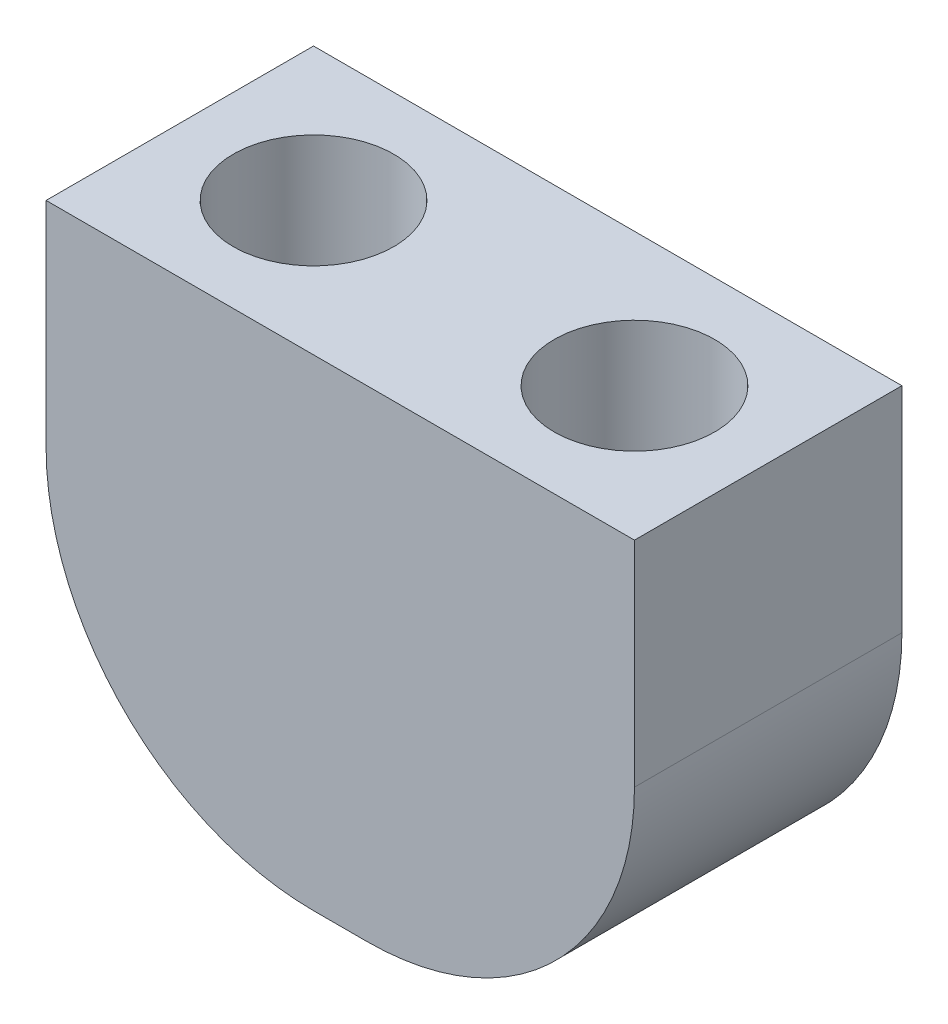
ISO-10303-21;
HEADER;
FILE_DESCRIPTION(('STEP AP214'),'2;1');
FILE_NAME('part.step','',(''),(''),'','','');
FILE_SCHEMA(('AUTOMOTIVE_DESIGN { 1 0 10303 214 1 1 1 1 }'));
ENDSEC;
DATA;
#1=APPLICATION_CONTEXT('core data for automotive mechanical design processes');
#2=APPLICATION_PROTOCOL_DEFINITION('international standard','automotive_design',2000,#1);
#3=PRODUCT_CONTEXT('',#1,'mechanical');
#4=PRODUCT('Part','Part','',(#3));
#5=PRODUCT_RELATED_PRODUCT_CATEGORY('part','',(#4));
#6=PRODUCT_DEFINITION_FORMATION('','',#4);
#7=PRODUCT_DEFINITION_CONTEXT('part definition',#1,'design');
#8=PRODUCT_DEFINITION('design','',#6,#7);
#9=PRODUCT_DEFINITION_SHAPE('','',#8);
#10=(LENGTH_UNIT() NAMED_UNIT(*) SI_UNIT(.MILLI.,.METRE.));
#11=(NAMED_UNIT(*) PLANE_ANGLE_UNIT() SI_UNIT($,.RADIAN.));
#12=(NAMED_UNIT(*) SI_UNIT($,.STERADIAN.) SOLID_ANGLE_UNIT());
#13=UNCERTAINTY_MEASURE_WITH_UNIT(LENGTH_MEASURE(1.E-05),#10,'distance_accuracy_value','');
#14=(GEOMETRIC_REPRESENTATION_CONTEXT(3) GLOBAL_UNCERTAINTY_ASSIGNED_CONTEXT((#13)) GLOBAL_UNIT_ASSIGNED_CONTEXT((#10,
#11,#12)) REPRESENTATION_CONTEXT('',''));
#15=CARTESIAN_POINT('',(0.,0.,0.));
#16=DIRECTION('',(0.,0.,1.));
#17=DIRECTION('',(1.,0.,0.));
#18=AXIS2_PLACEMENT_3D('',#15,#16,#17);
#19=CARTESIAN_POINT('',(11.,28.,-5.));
#20=DIRECTION('',(-1.,0.,0.));
#21=DIRECTION('',(0.,0.,1.));
#22=AXIS2_PLACEMENT_3D('',#19,#20,#21);
#23=PLANE('',#22);
#24=DIRECTION('',(0.,-1.,0.));
#25=VECTOR('',#24,1.);
#26=CARTESIAN_POINT('',(11.,28.,5.));
#27=LINE('',#26,#25);
#28=CARTESIAN_POINT('',(11.,28.,5.));
#29=VERTEX_POINT('',#28);
#30=CARTESIAN_POINT('',(11.,20.,5.));
#31=VERTEX_POINT('',#30);
#32=EDGE_CURVE('E147',#29,#31,#27,.T.);
#33=ORIENTED_EDGE('',*,*,#32,.T.);
#34=DIRECTION('',(0.,0.,-1.));
#35=VECTOR('',#34,1.);
#36=CARTESIAN_POINT('',(11.,20.,-5.));
#37=LINE('',#36,#35);
#38=CARTESIAN_POINT('',(11.,20.,-5.));
#39=VERTEX_POINT('',#38);
#40=EDGE_CURVE('E119',#31,#39,#37,.T.);
#41=ORIENTED_EDGE('',*,*,#40,.T.);
#42=DIRECTION('',(0.,-1.,0.));
#43=VECTOR('',#42,1.);
#44=CARTESIAN_POINT('',(11.,28.,-5.));
#45=LINE('',#44,#43);
#46=CARTESIAN_POINT('',(11.,28.,-5.));
#47=VERTEX_POINT('',#46);
#48=EDGE_CURVE('E99',#47,#39,#45,.T.);
#49=ORIENTED_EDGE('',*,*,#48,.F.);
#50=DIRECTION('',(0.,0.,-1.));
#51=VECTOR('',#50,1.);
#52=CARTESIAN_POINT('',(11.,28.,-5.));
#53=LINE('',#52,#51);
#54=EDGE_CURVE('E105',#29,#47,#53,.T.);
#55=ORIENTED_EDGE('',*,*,#54,.F.);
#56=EDGE_LOOP('',(#33,#41,#49,#55));
#57=FACE_BOUND('',#56,.T.);
#58=ADVANCED_FACE('F39',(#57),#23,.F.);
#59=CARTESIAN_POINT('',(-11.,28.,-5.));
#60=DIRECTION('',(0.,0.,1.));
#61=DIRECTION('',(1.,0.,0.));
#62=AXIS2_PLACEMENT_3D('',#59,#60,#61);
#63=PLANE('',#62);
#64=CARTESIAN_POINT('',(0.,17.,-5.));
#65=DIRECTION('',(0.,0.,-1.));
#66=DIRECTION('',(-1.,0.,0.));
#67=AXIS2_PLACEMENT_3D('',#64,#65,#66);
#68=CIRCLE('',#67,5.);
#69=CARTESIAN_POINT('',(-5.,17.,-5.));
#70=VERTEX_POINT('',#69);
#71=EDGE_CURVE('E165',#70,#70,#68,.T.);
#72=ORIENTED_EDGE('',*,*,#71,.F.);
#73=EDGE_LOOP('',(#72));
#74=FACE_BOUND('',#73,.T.);
#75=ORIENTED_EDGE('',*,*,#48,.T.);
#76=CARTESIAN_POINT('',(0.999999999999999,20.,-5.));
#77=DIRECTION('',(0.,0.,1.));
#78=DIRECTION('',(1.,0.,0.));
#79=AXIS2_PLACEMENT_3D('',#76,#77,#78);
#80=CIRCLE('',#79,10.);
#81=CARTESIAN_POINT('',(0.999999999999997,10.,-5.));
#82=VERTEX_POINT('',#81);
#83=EDGE_CURVE('E132',#39,#82,#80,.F.);
#84=ORIENTED_EDGE('',*,*,#83,.T.);
#85=DIRECTION('',(1.,0.,0.));
#86=VECTOR('',#85,1.);
#87=CARTESIAN_POINT('',(-11.,10.,-5.));
#88=LINE('',#87,#86);
#89=CARTESIAN_POINT('',(-1.,10.,-5.));
#90=VERTEX_POINT('',#89);
#91=EDGE_CURVE('E154',#90,#82,#88,.T.);
#92=ORIENTED_EDGE('',*,*,#91,.F.);
#93=CARTESIAN_POINT('',(-0.999999999999999,20.,-5.));
#94=DIRECTION('',(0.,0.,1.));
#95=DIRECTION('',(1.,0.,0.));
#96=AXIS2_PLACEMENT_3D('',#93,#94,#95);
#97=CIRCLE('',#96,10.);
#98=CARTESIAN_POINT('',(-11.,20.,-5.));
#99=VERTEX_POINT('',#98);
#100=EDGE_CURVE('E124',#90,#99,#97,.F.);
#101=ORIENTED_EDGE('',*,*,#100,.T.);
#102=DIRECTION('',(0.,-1.,0.));
#103=VECTOR('',#102,1.);
#104=CARTESIAN_POINT('',(-11.,28.,-5.));
#105=LINE('',#104,#103);
#106=CARTESIAN_POINT('',(-11.,28.,-5.));
#107=VERTEX_POINT('',#106);
#108=EDGE_CURVE('E100',#107,#99,#105,.T.);
#109=ORIENTED_EDGE('',*,*,#108,.F.);
#110=DIRECTION('',(-1.,0.,0.));
#111=VECTOR('',#110,1.);
#112=CARTESIAN_POINT('',(-11.,28.,-5.));
#113=LINE('',#112,#111);
#114=EDGE_CURVE('E95',#47,#107,#113,.T.);
#115=ORIENTED_EDGE('',*,*,#114,.F.);
#116=EDGE_LOOP('',(#75,#84,#92,#101,#109,#115));
#117=FACE_BOUND('',#116,.T.);
#118=ADVANCED_FACE('F97',(#74,#117),#63,.F.);
#119=CARTESIAN_POINT('',(-11.,28.,-5.));
#120=DIRECTION('',(1.,0.,0.));
#121=DIRECTION('',(0.,0.,-1.));
#122=AXIS2_PLACEMENT_3D('',#119,#120,#121);
#123=PLANE('',#122);
#124=ORIENTED_EDGE('',*,*,#108,.T.);
#125=DIRECTION('',(0.,0.,-1.));
#126=VECTOR('',#125,1.);
#127=CARTESIAN_POINT('',(-11.,20.,-5.));
#128=LINE('',#127,#126);
#129=CARTESIAN_POINT('',(-11.,20.,5.));
#130=VERTEX_POINT('',#129);
#131=EDGE_CURVE('E11',#99,#130,#128,.F.);
#132=ORIENTED_EDGE('',*,*,#131,.T.);
#133=DIRECTION('',(0.,-1.,0.));
#134=VECTOR('',#133,1.);
#135=CARTESIAN_POINT('',(-11.,28.,5.));
#136=LINE('',#135,#134);
#137=CARTESIAN_POINT('',(-11.,28.,5.));
#138=VERTEX_POINT('',#137);
#139=EDGE_CURVE('E126',#138,#130,#136,.T.);
#140=ORIENTED_EDGE('',*,*,#139,.F.);
#141=DIRECTION('',(0.,0.,1.));
#142=VECTOR('',#141,1.);
#143=CARTESIAN_POINT('',(-11.,28.,-5.));
#144=LINE('',#143,#142);
#145=EDGE_CURVE('E104',#107,#138,#144,.T.);
#146=ORIENTED_EDGE('',*,*,#145,.F.);
#147=EDGE_LOOP('',(#124,#132,#140,#146));
#148=FACE_BOUND('',#147,.T.);
#149=ADVANCED_FACE('F189',(#148),#123,.F.);
#150=CARTESIAN_POINT('',(-11.,28.,5.));
#151=DIRECTION('',(0.,0.,-1.));
#152=DIRECTION('',(-1.,0.,0.));
#153=AXIS2_PLACEMENT_3D('',#150,#151,#152);
#154=PLANE('',#153);
#155=DIRECTION('',(1.,0.,0.));
#156=VECTOR('',#155,1.);
#157=CARTESIAN_POINT('',(-11.,10.,5.));
#158=LINE('',#157,#156);
#159=CARTESIAN_POINT('',(-1.,10.,5.));
#160=VERTEX_POINT('',#159);
#161=CARTESIAN_POINT('',(0.999999999999997,10.,5.));
#162=VERTEX_POINT('',#161);
#163=EDGE_CURVE('E148',#160,#162,#158,.T.);
#164=ORIENTED_EDGE('',*,*,#163,.T.);
#165=CARTESIAN_POINT('',(0.999999999999999,20.,5.));
#166=DIRECTION('',(0.,0.,-1.));
#167=DIRECTION('',(-1.,0.,0.));
#168=AXIS2_PLACEMENT_3D('',#165,#166,#167);
#169=CIRCLE('',#168,10.);
#170=EDGE_CURVE('E48',#162,#31,#169,.F.);
#171=ORIENTED_EDGE('',*,*,#170,.T.);
#172=ORIENTED_EDGE('',*,*,#32,.F.);
#173=DIRECTION('',(1.,0.,0.));
#174=VECTOR('',#173,1.);
#175=CARTESIAN_POINT('',(-11.,28.,5.));
#176=LINE('',#175,#174);
#177=EDGE_CURVE('E110',#138,#29,#176,.T.);
#178=ORIENTED_EDGE('',*,*,#177,.F.);
#179=ORIENTED_EDGE('',*,*,#139,.T.);
#180=CARTESIAN_POINT('',(-0.999999999999999,20.,5.));
#181=DIRECTION('',(0.,0.,-1.));
#182=DIRECTION('',(-1.,0.,0.));
#183=AXIS2_PLACEMENT_3D('',#180,#181,#182);
#184=CIRCLE('',#183,10.);
#185=EDGE_CURVE('E141',#130,#160,#184,.F.);
#186=ORIENTED_EDGE('',*,*,#185,.T.);
#187=EDGE_LOOP('',(#164,#171,#172,#178,#179,#186));
#188=FACE_BOUND('',#187,.T.);
#189=ADVANCED_FACE('F146',(#188),#154,.F.);
#190=CARTESIAN_POINT('',(0.,28.,0.));
#191=DIRECTION('',(0.,1.,0.));
#192=DIRECTION('',(0.,0.,1.));
#193=AXIS2_PLACEMENT_3D('',#190,#191,#192);
#194=PLANE('',#193);
#195=CARTESIAN_POINT('',(-6.,28.,0.));
#196=DIRECTION('',(0.,1.,0.));
#197=DIRECTION('',(0.,0.,1.));
#198=AXIS2_PLACEMENT_3D('',#195,#196,#197);
#199=CIRCLE('',#198,3.);
#200=CARTESIAN_POINT('',(-6.,28.,3.));
#201=VERTEX_POINT('',#200);
#202=EDGE_CURVE('E172',#201,#201,#199,.T.);
#203=ORIENTED_EDGE('',*,*,#202,.F.);
#204=EDGE_LOOP('',(#203));
#205=FACE_BOUND('',#204,.T.);
#206=CARTESIAN_POINT('',(6.,28.,0.));
#207=DIRECTION('',(0.,1.,0.));
#208=DIRECTION('',(0.,0.,1.));
#209=AXIS2_PLACEMENT_3D('',#206,#207,#208);
#210=CIRCLE('',#209,3.);
#211=CARTESIAN_POINT('',(6.,28.,3.));
#212=VERTEX_POINT('',#211);
#213=EDGE_CURVE('E162',#212,#212,#210,.T.);
#214=ORIENTED_EDGE('',*,*,#213,.F.);
#215=EDGE_LOOP('',(#214));
#216=FACE_BOUND('',#215,.T.);
#217=ORIENTED_EDGE('',*,*,#54,.T.);
#218=ORIENTED_EDGE('',*,*,#114,.T.);
#219=ORIENTED_EDGE('',*,*,#145,.T.);
#220=ORIENTED_EDGE('',*,*,#177,.T.);
#221=EDGE_LOOP('',(#217,#218,#219,#220));
#222=FACE_BOUND('',#221,.T.);
#223=ADVANCED_FACE('F108',(#205,#216,#222),#194,.T.);
#224=CARTESIAN_POINT('',(6.,23.,0.));
#225=DIRECTION('',(0.,1.,0.));
#226=DIRECTION('',(0.,0.,1.));
#227=AXIS2_PLACEMENT_3D('',#224,#225,#226);
#228=CYLINDRICAL_SURFACE('',#227,3.);
#229=CARTESIAN_POINT('',(6.,23.,0.));
#230=DIRECTION('',(0.,1.,0.));
#231=DIRECTION('',(0.,0.,1.));
#232=AXIS2_PLACEMENT_3D('',#229,#230,#231);
#233=CIRCLE('',#232,3.);
#234=CARTESIAN_POINT('',(6.,23.,3.));
#235=VERTEX_POINT('',#234);
#236=EDGE_CURVE('E176',#235,#235,#233,.T.);
#237=ORIENTED_EDGE('',*,*,#236,.F.);
#238=EDGE_LOOP('',(#237));
#239=FACE_BOUND('',#238,.T.);
#240=ORIENTED_EDGE('',*,*,#213,.T.);
#241=EDGE_LOOP('',(#240));
#242=FACE_BOUND('',#241,.T.);
#243=ADVANCED_FACE('F231',(#239,#242),#228,.F.);
#244=CARTESIAN_POINT('',(6.,23.,0.));
#245=DIRECTION('',(0.,1.,0.));
#246=DIRECTION('',(0.,0.,1.));
#247=AXIS2_PLACEMENT_3D('',#244,#245,#246);
#248=PLANE('',#247);
#249=ORIENTED_EDGE('',*,*,#236,.T.);
#250=EDGE_LOOP('',(#249));
#251=FACE_BOUND('',#250,.T.);
#252=ADVANCED_FACE('F227',(#251),#248,.T.);
#253=CARTESIAN_POINT('',(-6.,23.,0.));
#254=DIRECTION('',(0.,1.,0.));
#255=DIRECTION('',(0.,0.,1.));
#256=AXIS2_PLACEMENT_3D('',#253,#254,#255);
#257=CYLINDRICAL_SURFACE('',#256,3.);
#258=CARTESIAN_POINT('',(-6.,23.,0.));
#259=DIRECTION('',(0.,1.,0.));
#260=DIRECTION('',(0.,0.,1.));
#261=AXIS2_PLACEMENT_3D('',#258,#259,#260);
#262=CIRCLE('',#261,3.);
#263=CARTESIAN_POINT('',(-6.,23.,3.));
#264=VERTEX_POINT('',#263);
#265=EDGE_CURVE('E115',#264,#264,#262,.T.);
#266=ORIENTED_EDGE('',*,*,#265,.F.);
#267=EDGE_LOOP('',(#266));
#268=FACE_BOUND('',#267,.T.);
#269=ORIENTED_EDGE('',*,*,#202,.T.);
#270=EDGE_LOOP('',(#269));
#271=FACE_BOUND('',#270,.T.);
#272=ADVANCED_FACE('F223',(#268,#271),#257,.F.);
#273=CARTESIAN_POINT('',(-6.,23.,0.));
#274=DIRECTION('',(0.,1.,0.));
#275=DIRECTION('',(0.,0.,1.));
#276=AXIS2_PLACEMENT_3D('',#273,#274,#275);
#277=PLANE('',#276);
#278=ORIENTED_EDGE('',*,*,#265,.T.);
#279=EDGE_LOOP('',(#278));
#280=FACE_BOUND('',#279,.T.);
#281=ADVANCED_FACE('F220',(#280),#277,.T.);
#282=CARTESIAN_POINT('',(-11.,10.,5.));
#283=DIRECTION('',(0.,1.,0.));
#284=DIRECTION('',(-1.,0.,0.));
#285=AXIS2_PLACEMENT_3D('',#282,#283,#284);
#286=PLANE('',#285);
#287=ORIENTED_EDGE('',*,*,#91,.T.);
#288=DIRECTION('',(0.,0.,-1.));
#289=VECTOR('',#288,1.);
#290=CARTESIAN_POINT('',(0.999999999999997,10.,5.));
#291=LINE('',#290,#289);
#292=EDGE_CURVE('E61',#82,#162,#291,.F.);
#293=ORIENTED_EDGE('',*,*,#292,.T.);
#294=ORIENTED_EDGE('',*,*,#163,.F.);
#295=DIRECTION('',(0.,0.,-1.));
#296=VECTOR('',#295,1.);
#297=CARTESIAN_POINT('',(-1.,10.,5.));
#298=LINE('',#297,#296);
#299=EDGE_CURVE('E135',#160,#90,#298,.T.);
#300=ORIENTED_EDGE('',*,*,#299,.T.);
#301=EDGE_LOOP('',(#287,#293,#294,#300));
#302=FACE_BOUND('',#301,.T.);
#303=ADVANCED_FACE('F155',(#302),#286,.F.);
#304=CARTESIAN_POINT('',(0.,17.,0.));
#305=DIRECTION('',(0.,0.,-1.));
#306=DIRECTION('',(-1.,0.,0.));
#307=AXIS2_PLACEMENT_3D('',#304,#305,#306);
#308=CYLINDRICAL_SURFACE('',#307,5.);
#309=CARTESIAN_POINT('',(0.,17.,0.));
#310=DIRECTION('',(0.,0.,-1.));
#311=DIRECTION('',(-1.,0.,0.));
#312=AXIS2_PLACEMENT_3D('',#309,#310,#311);
#313=CIRCLE('',#312,5.);
#314=CARTESIAN_POINT('',(-5.,17.,0.));
#315=VERTEX_POINT('',#314);
#316=EDGE_CURVE('E158',#315,#315,#313,.T.);
#317=ORIENTED_EDGE('',*,*,#316,.F.);
#318=EDGE_LOOP('',(#317));
#319=FACE_BOUND('',#318,.T.);
#320=ORIENTED_EDGE('',*,*,#71,.T.);
#321=EDGE_LOOP('',(#320));
#322=FACE_BOUND('',#321,.T.);
#323=ADVANCED_FACE('F209',(#319,#322),#308,.F.);
#324=CARTESIAN_POINT('',(0.,17.,0.));
#325=DIRECTION('',(0.,0.,-1.));
#326=DIRECTION('',(-1.,0.,0.));
#327=AXIS2_PLACEMENT_3D('',#324,#325,#326);
#328=PLANE('',#327);
#329=ORIENTED_EDGE('',*,*,#316,.T.);
#330=EDGE_LOOP('',(#329));
#331=FACE_BOUND('',#330,.T.);
#332=ADVANCED_FACE('F204',(#331),#328,.T.);
#333=CARTESIAN_POINT('',(0.999999999999999,20.,-5.));
#334=DIRECTION('',(0.,0.,-1.));
#335=DIRECTION('',(0.,1.,0.));
#336=AXIS2_PLACEMENT_3D('',#333,#334,#335);
#337=CYLINDRICAL_SURFACE('',#336,10.);
#338=ORIENTED_EDGE('',*,*,#170,.F.);
#339=ORIENTED_EDGE('',*,*,#292,.F.);
#340=ORIENTED_EDGE('',*,*,#83,.F.);
#341=ORIENTED_EDGE('',*,*,#40,.F.);
#342=EDGE_LOOP('',(#338,#339,#340,#341));
#343=FACE_BOUND('',#342,.T.);
#344=ADVANCED_FACE('F152',(#343),#337,.T.);
#345=CARTESIAN_POINT('',(-0.999999999999999,20.,5.));
#346=DIRECTION('',(0.,0.,-1.));
#347=DIRECTION('',(0.,1.,0.));
#348=AXIS2_PLACEMENT_3D('',#345,#346,#347);
#349=CYLINDRICAL_SURFACE('',#348,10.);
#350=ORIENTED_EDGE('',*,*,#185,.F.);
#351=ORIENTED_EDGE('',*,*,#131,.F.);
#352=ORIENTED_EDGE('',*,*,#100,.F.);
#353=ORIENTED_EDGE('',*,*,#299,.F.);
#354=EDGE_LOOP('',(#350,#351,#352,#353));
#355=FACE_BOUND('',#354,.T.);
#356=ADVANCED_FACE('F41',(#355),#349,.T.);
#357=CLOSED_SHELL('',(#58,#118,#149,#189,#223,#243,#252,#272,#281,#303,#323,#332,#344,#356));
#358=MANIFOLD_SOLID_BREP('B2',#357);
#359=ADVANCED_BREP_SHAPE_REPRESENTATION('',(#18,#358),#14);
#360=SHAPE_DEFINITION_REPRESENTATION(#9,#359);
ENDSEC;
END-ISO-10303-21;
